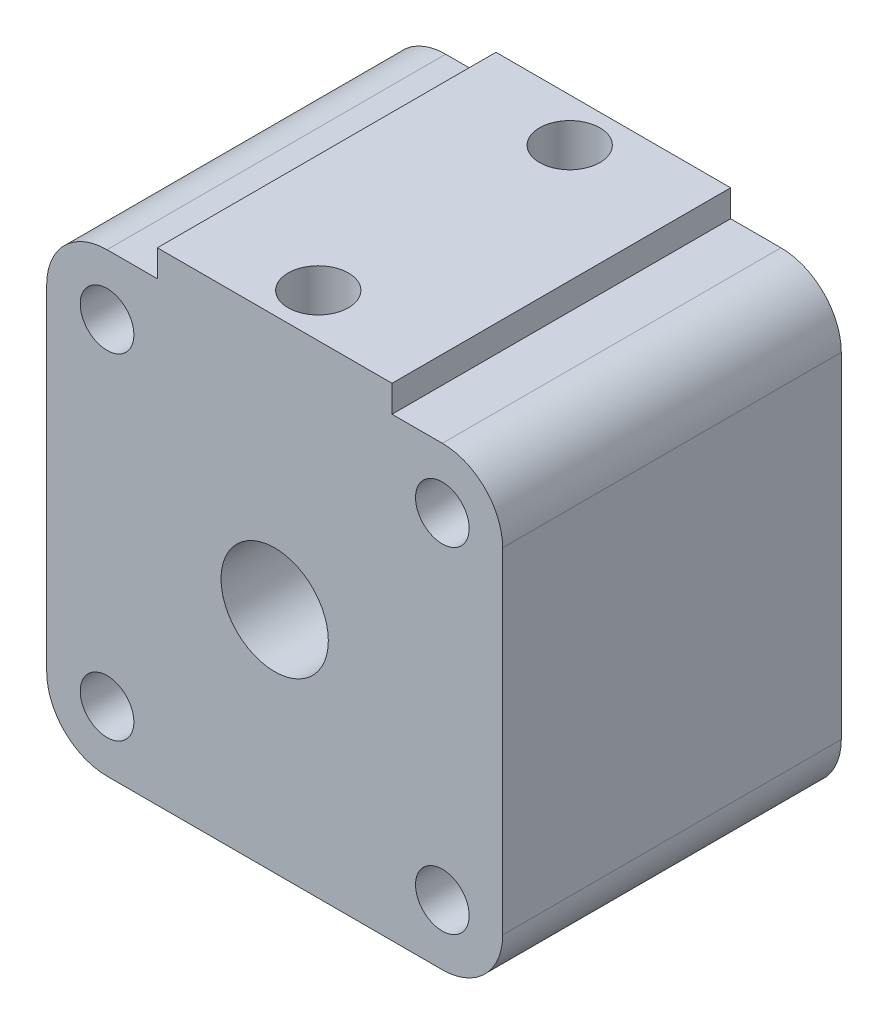
ISO-10303-21;
HEADER;
FILE_DESCRIPTION(('STEP AP214'),'2;1');
FILE_NAME('part.step','',(''),(''),'','','');
FILE_SCHEMA(('AUTOMOTIVE_DESIGN { 1 0 10303 214 1 1 1 1 }'));
ENDSEC;
DATA;
#1=APPLICATION_CONTEXT('core data for automotive mechanical design processes');
#2=APPLICATION_PROTOCOL_DEFINITION('international standard','automotive_design',2000,#1);
#3=PRODUCT_CONTEXT('',#1,'mechanical');
#4=PRODUCT('Part','Part','',(#3));
#5=PRODUCT_RELATED_PRODUCT_CATEGORY('part','',(#4));
#6=PRODUCT_DEFINITION_FORMATION('','',#4);
#7=PRODUCT_DEFINITION_CONTEXT('part definition',#1,'design');
#8=PRODUCT_DEFINITION('design','',#6,#7);
#9=PRODUCT_DEFINITION_SHAPE('','',#8);
#10=(LENGTH_UNIT() NAMED_UNIT(*) SI_UNIT(.MILLI.,.METRE.));
#11=(NAMED_UNIT(*) PLANE_ANGLE_UNIT() SI_UNIT($,.RADIAN.));
#12=(NAMED_UNIT(*) SI_UNIT($,.STERADIAN.) SOLID_ANGLE_UNIT());
#13=UNCERTAINTY_MEASURE_WITH_UNIT(LENGTH_MEASURE(1.E-05),#10,'distance_accuracy_value','');
#14=(GEOMETRIC_REPRESENTATION_CONTEXT(3) GLOBAL_UNCERTAINTY_ASSIGNED_CONTEXT((#13)) GLOBAL_UNIT_ASSIGNED_CONTEXT((#10,
#11,#12)) REPRESENTATION_CONTEXT('',''));
#15=CARTESIAN_POINT('',(0.,0.,0.));
#16=DIRECTION('',(0.,0.,1.));
#17=DIRECTION('',(1.,0.,0.));
#18=AXIS2_PLACEMENT_3D('',#15,#16,#17);
#19=CARTESIAN_POINT('',(25.,25.,-50.5));
#20=DIRECTION('',(0.,0.,1.));
#21=DIRECTION('',(1.,0.,0.));
#22=AXIS2_PLACEMENT_3D('',#19,#20,#21);
#23=CYLINDRICAL_SURFACE('',#22,9.00000000000001);
#24=CARTESIAN_POINT('',(25.,25.,0.));
#25=DIRECTION('',(0.,0.,1.));
#26=DIRECTION('',(-1.,0.,0.));
#27=AXIS2_PLACEMENT_3D('',#24,#25,#26);
#28=CIRCLE('',#27,9.00000000000001);
#29=CARTESIAN_POINT('',(34.,25.,0.));
#30=VERTEX_POINT('',#29);
#31=CARTESIAN_POINT('',(25.,34.,0.));
#32=VERTEX_POINT('',#31);
#33=EDGE_CURVE('E154',#30,#32,#28,.T.);
#34=ORIENTED_EDGE('',*,*,#33,.F.);
#35=DIRECTION('',(0.,0.,1.));
#36=VECTOR('',#35,1.);
#37=CARTESIAN_POINT('',(34.,25.,-50.5));
#38=LINE('',#37,#36);
#39=CARTESIAN_POINT('',(34.,25.,-50.5));
#40=VERTEX_POINT('',#39);
#41=EDGE_CURVE('E11',#40,#30,#38,.T.);
#42=ORIENTED_EDGE('',*,*,#41,.F.);
#43=CARTESIAN_POINT('',(25.,25.,-50.5));
#44=DIRECTION('',(0.,0.,1.));
#45=DIRECTION('',(-1.,0.,0.));
#46=AXIS2_PLACEMENT_3D('',#43,#44,#45);
#47=CIRCLE('',#46,9.00000000000001);
#48=CARTESIAN_POINT('',(25.,34.,-50.5));
#49=VERTEX_POINT('',#48);
#50=EDGE_CURVE('E187',#40,#49,#47,.T.);
#51=ORIENTED_EDGE('',*,*,#50,.T.);
#52=DIRECTION('',(0.,0.,1.));
#53=VECTOR('',#52,1.);
#54=CARTESIAN_POINT('',(25.,34.,-50.5));
#55=LINE('',#54,#53);
#56=EDGE_CURVE('E36',#49,#32,#55,.T.);
#57=ORIENTED_EDGE('',*,*,#56,.T.);
#58=EDGE_LOOP('',(#34,#42,#51,#57));
#59=FACE_BOUND('',#58,.T.);
#60=ADVANCED_FACE('F33',(#59),#23,.T.);
#61=CARTESIAN_POINT('',(34.,25.,-50.5));
#62=DIRECTION('',(1.,0.,0.));
#63=DIRECTION('',(0.,1.,0.));
#64=AXIS2_PLACEMENT_3D('',#61,#62,#63);
#65=PLANE('',#64);
#66=DIRECTION('',(0.,1.,0.));
#67=VECTOR('',#66,1.);
#68=CARTESIAN_POINT('',(34.,25.,0.));
#69=LINE('',#68,#67);
#70=CARTESIAN_POINT('',(34.,-25.,0.));
#71=VERTEX_POINT('',#70);
#72=EDGE_CURVE('E185',#71,#30,#69,.T.);
#73=ORIENTED_EDGE('',*,*,#72,.F.);
#74=DIRECTION('',(0.,0.,1.));
#75=VECTOR('',#74,1.);
#76=CARTESIAN_POINT('',(34.,-25.,-50.5));
#77=LINE('',#76,#75);
#78=CARTESIAN_POINT('',(34.,-25.,-50.5));
#79=VERTEX_POINT('',#78);
#80=EDGE_CURVE('E42',#79,#71,#77,.T.);
#81=ORIENTED_EDGE('',*,*,#80,.F.);
#82=DIRECTION('',(0.,1.,0.));
#83=VECTOR('',#82,1.);
#84=CARTESIAN_POINT('',(34.,25.,-50.5));
#85=LINE('',#84,#83);
#86=EDGE_CURVE('E144',#79,#40,#85,.T.);
#87=ORIENTED_EDGE('',*,*,#86,.T.);
#88=ORIENTED_EDGE('',*,*,#41,.T.);
#89=EDGE_LOOP('',(#73,#81,#87,#88));
#90=FACE_BOUND('',#89,.T.);
#91=ADVANCED_FACE('F207',(#90),#65,.T.);
#92=CARTESIAN_POINT('',(25.,-25.,-50.5));
#93=DIRECTION('',(0.,0.,1.));
#94=DIRECTION('',(1.,0.,0.));
#95=AXIS2_PLACEMENT_3D('',#92,#93,#94);
#96=CYLINDRICAL_SURFACE('',#95,9.00000000000001);
#97=CARTESIAN_POINT('',(25.,-25.,0.));
#98=DIRECTION('',(0.,0.,1.));
#99=DIRECTION('',(-1.,0.,0.));
#100=AXIS2_PLACEMENT_3D('',#97,#98,#99);
#101=CIRCLE('',#100,9.00000000000001);
#102=CARTESIAN_POINT('',(25.,-34.,0.));
#103=VERTEX_POINT('',#102);
#104=EDGE_CURVE('E131',#103,#71,#101,.T.);
#105=ORIENTED_EDGE('',*,*,#104,.F.);
#106=DIRECTION('',(0.,0.,1.));
#107=VECTOR('',#106,1.);
#108=CARTESIAN_POINT('',(25.,-34.,-50.5));
#109=LINE('',#108,#107);
#110=CARTESIAN_POINT('',(25.,-34.,-50.5));
#111=VERTEX_POINT('',#110);
#112=EDGE_CURVE('E126',#111,#103,#109,.T.);
#113=ORIENTED_EDGE('',*,*,#112,.F.);
#114=CARTESIAN_POINT('',(25.,-25.,-50.5));
#115=DIRECTION('',(0.,0.,1.));
#116=DIRECTION('',(-1.,0.,0.));
#117=AXIS2_PLACEMENT_3D('',#114,#115,#116);
#118=CIRCLE('',#117,9.00000000000001);
#119=EDGE_CURVE('E129',#111,#79,#118,.T.);
#120=ORIENTED_EDGE('',*,*,#119,.T.);
#121=ORIENTED_EDGE('',*,*,#80,.T.);
#122=EDGE_LOOP('',(#105,#113,#120,#121));
#123=FACE_BOUND('',#122,.T.);
#124=ADVANCED_FACE('F128',(#123),#96,.T.);
#125=CARTESIAN_POINT('',(-25.,-34.,-50.5));
#126=DIRECTION('',(0.,-1.,0.));
#127=DIRECTION('',(0.,0.,-1.));
#128=AXIS2_PLACEMENT_3D('',#125,#126,#127);
#129=PLANE('',#128);
#130=DIRECTION('',(1.,0.,0.));
#131=VECTOR('',#130,1.);
#132=CARTESIAN_POINT('',(-25.,-34.,0.));
#133=LINE('',#132,#131);
#134=CARTESIAN_POINT('',(-25.,-34.,0.));
#135=VERTEX_POINT('',#134);
#136=EDGE_CURVE('E182',#135,#103,#133,.T.);
#137=ORIENTED_EDGE('',*,*,#136,.F.);
#138=DIRECTION('',(0.,0.,1.));
#139=VECTOR('',#138,1.);
#140=CARTESIAN_POINT('',(-25.,-34.,-50.5));
#141=LINE('',#140,#139);
#142=CARTESIAN_POINT('',(-25.,-34.,-50.5));
#143=VERTEX_POINT('',#142);
#144=EDGE_CURVE('E136',#143,#135,#141,.T.);
#145=ORIENTED_EDGE('',*,*,#144,.F.);
#146=DIRECTION('',(1.,0.,0.));
#147=VECTOR('',#146,1.);
#148=CARTESIAN_POINT('',(-25.,-34.,-50.5));
#149=LINE('',#148,#147);
#150=EDGE_CURVE('E142',#143,#111,#149,.T.);
#151=ORIENTED_EDGE('',*,*,#150,.T.);
#152=ORIENTED_EDGE('',*,*,#112,.T.);
#153=EDGE_LOOP('',(#137,#145,#151,#152));
#154=FACE_BOUND('',#153,.T.);
#155=ADVANCED_FACE('F146',(#154),#129,.T.);
#156=CARTESIAN_POINT('',(-25.,-25.,-50.5));
#157=DIRECTION('',(0.,0.,1.));
#158=DIRECTION('',(1.,0.,0.));
#159=AXIS2_PLACEMENT_3D('',#156,#157,#158);
#160=CYLINDRICAL_SURFACE('',#159,9.00000000000001);
#161=CARTESIAN_POINT('',(-25.,-25.,0.));
#162=DIRECTION('',(0.,0.,1.));
#163=DIRECTION('',(-1.,0.,0.));
#164=AXIS2_PLACEMENT_3D('',#161,#162,#163);
#165=CIRCLE('',#164,9.00000000000001);
#166=CARTESIAN_POINT('',(-34.,-25.,0.));
#167=VERTEX_POINT('',#166);
#168=EDGE_CURVE('E179',#167,#135,#165,.T.);
#169=ORIENTED_EDGE('',*,*,#168,.F.);
#170=DIRECTION('',(0.,0.,1.));
#171=VECTOR('',#170,1.);
#172=CARTESIAN_POINT('',(-34.,-25.,-50.5));
#173=LINE('',#172,#171);
#174=CARTESIAN_POINT('',(-34.,-25.,-50.5));
#175=VERTEX_POINT('',#174);
#176=EDGE_CURVE('E191',#175,#167,#173,.T.);
#177=ORIENTED_EDGE('',*,*,#176,.F.);
#178=CARTESIAN_POINT('',(-25.,-25.,-50.5));
#179=DIRECTION('',(0.,0.,1.));
#180=DIRECTION('',(-1.,0.,0.));
#181=AXIS2_PLACEMENT_3D('',#178,#179,#180);
#182=CIRCLE('',#181,9.00000000000001);
#183=EDGE_CURVE('E147',#175,#143,#182,.T.);
#184=ORIENTED_EDGE('',*,*,#183,.T.);
#185=ORIENTED_EDGE('',*,*,#144,.T.);
#186=EDGE_LOOP('',(#169,#177,#184,#185));
#187=FACE_BOUND('',#186,.T.);
#188=ADVANCED_FACE('F220',(#187),#160,.T.);
#189=CARTESIAN_POINT('',(-34.,25.,-50.5));
#190=DIRECTION('',(-1.,0.,0.));
#191=DIRECTION('',(0.,0.,1.));
#192=AXIS2_PLACEMENT_3D('',#189,#190,#191);
#193=PLANE('',#192);
#194=DIRECTION('',(0.,-1.,0.));
#195=VECTOR('',#194,1.);
#196=CARTESIAN_POINT('',(-34.,25.,0.));
#197=LINE('',#196,#195);
#198=CARTESIAN_POINT('',(-34.,25.,0.));
#199=VERTEX_POINT('',#198);
#200=EDGE_CURVE('E176',#199,#167,#197,.T.);
#201=ORIENTED_EDGE('',*,*,#200,.F.);
#202=DIRECTION('',(0.,0.,1.));
#203=VECTOR('',#202,1.);
#204=CARTESIAN_POINT('',(-34.,25.,-50.5));
#205=LINE('',#204,#203);
#206=CARTESIAN_POINT('',(-34.,25.,-50.5));
#207=VERTEX_POINT('',#206);
#208=EDGE_CURVE('E193',#207,#199,#205,.T.);
#209=ORIENTED_EDGE('',*,*,#208,.F.);
#210=DIRECTION('',(0.,-1.,0.));
#211=VECTOR('',#210,1.);
#212=CARTESIAN_POINT('',(-34.,25.,-50.5));
#213=LINE('',#212,#211);
#214=EDGE_CURVE('E149',#207,#175,#213,.T.);
#215=ORIENTED_EDGE('',*,*,#214,.T.);
#216=ORIENTED_EDGE('',*,*,#176,.T.);
#217=EDGE_LOOP('',(#201,#209,#215,#216));
#218=FACE_BOUND('',#217,.T.);
#219=ADVANCED_FACE('F223',(#218),#193,.T.);
#220=CARTESIAN_POINT('',(-25.,25.,-50.5));
#221=DIRECTION('',(0.,0.,1.));
#222=DIRECTION('',(1.,0.,0.));
#223=AXIS2_PLACEMENT_3D('',#220,#221,#222);
#224=CYLINDRICAL_SURFACE('',#223,9.);
#225=CARTESIAN_POINT('',(-25.,25.,0.));
#226=DIRECTION('',(0.,0.,1.));
#227=DIRECTION('',(-1.,0.,0.));
#228=AXIS2_PLACEMENT_3D('',#225,#226,#227);
#229=CIRCLE('',#228,9.);
#230=CARTESIAN_POINT('',(-25.,34.,0.));
#231=VERTEX_POINT('',#230);
#232=EDGE_CURVE('E173',#231,#199,#229,.T.);
#233=ORIENTED_EDGE('',*,*,#232,.F.);
#234=DIRECTION('',(0.,0.,1.));
#235=VECTOR('',#234,1.);
#236=CARTESIAN_POINT('',(-25.,34.,-50.5));
#237=LINE('',#236,#235);
#238=CARTESIAN_POINT('',(-25.,34.,-50.5));
#239=VERTEX_POINT('',#238);
#240=EDGE_CURVE('E195',#239,#231,#237,.T.);
#241=ORIENTED_EDGE('',*,*,#240,.F.);
#242=CARTESIAN_POINT('',(-25.,25.,-50.5));
#243=DIRECTION('',(0.,0.,1.));
#244=DIRECTION('',(-1.,0.,0.));
#245=AXIS2_PLACEMENT_3D('',#242,#243,#244);
#246=CIRCLE('',#245,9.);
#247=EDGE_CURVE('E371',#239,#207,#246,.T.);
#248=ORIENTED_EDGE('',*,*,#247,.T.);
#249=ORIENTED_EDGE('',*,*,#208,.T.);
#250=EDGE_LOOP('',(#233,#241,#248,#249));
#251=FACE_BOUND('',#250,.T.);
#252=ADVANCED_FACE('F227',(#251),#224,.T.);
#253=CARTESIAN_POINT('',(-25.,34.,-50.5));
#254=DIRECTION('',(0.,1.,0.));
#255=DIRECTION('',(-1.,0.,0.));
#256=AXIS2_PLACEMENT_3D('',#253,#254,#255);
#257=PLANE('',#256);
#258=DIRECTION('',(-1.,0.,0.));
#259=VECTOR('',#258,1.);
#260=CARTESIAN_POINT('',(-25.,34.,0.));
#261=LINE('',#260,#259);
#262=CARTESIAN_POINT('',(-17.5,34.,0.));
#263=VERTEX_POINT('',#262);
#264=EDGE_CURVE('E170',#263,#231,#261,.T.);
#265=ORIENTED_EDGE('',*,*,#264,.F.);
#266=DIRECTION('',(0.,0.,1.));
#267=VECTOR('',#266,1.);
#268=CARTESIAN_POINT('',(-17.5,34.,-50.5));
#269=LINE('',#268,#267);
#270=CARTESIAN_POINT('',(-17.5,34.,-50.5));
#271=VERTEX_POINT('',#270);
#272=EDGE_CURVE('E197',#271,#263,#269,.T.);
#273=ORIENTED_EDGE('',*,*,#272,.F.);
#274=DIRECTION('',(-1.,0.,0.));
#275=VECTOR('',#274,1.);
#276=CARTESIAN_POINT('',(-25.,34.,-50.5));
#277=LINE('',#276,#275);
#278=EDGE_CURVE('E368',#271,#239,#277,.T.);
#279=ORIENTED_EDGE('',*,*,#278,.T.);
#280=ORIENTED_EDGE('',*,*,#240,.T.);
#281=EDGE_LOOP('',(#265,#273,#279,#280));
#282=FACE_BOUND('',#281,.T.);
#283=ADVANCED_FACE('F231',(#282),#257,.T.);
#284=CARTESIAN_POINT('',(-17.5,34.,-50.5));
#285=DIRECTION('',(-1.,0.,0.));
#286=DIRECTION('',(0.,0.,1.));
#287=AXIS2_PLACEMENT_3D('',#284,#285,#286);
#288=PLANE('',#287);
#289=DIRECTION('',(0.,-1.,0.));
#290=VECTOR('',#289,1.);
#291=CARTESIAN_POINT('',(-17.5,34.,0.));
#292=LINE('',#291,#290);
#293=CARTESIAN_POINT('',(-17.5,38.,0.));
#294=VERTEX_POINT('',#293);
#295=EDGE_CURVE('E167',#294,#263,#292,.T.);
#296=ORIENTED_EDGE('',*,*,#295,.F.);
#297=DIRECTION('',(0.,0.,1.));
#298=VECTOR('',#297,1.);
#299=CARTESIAN_POINT('',(-17.5,38.,-50.5));
#300=LINE('',#299,#298);
#301=CARTESIAN_POINT('',(-17.5,38.,-50.5));
#302=VERTEX_POINT('',#301);
#303=EDGE_CURVE('E199',#302,#294,#300,.T.);
#304=ORIENTED_EDGE('',*,*,#303,.F.);
#305=DIRECTION('',(0.,-1.,0.));
#306=VECTOR('',#305,1.);
#307=CARTESIAN_POINT('',(-17.5,34.,-50.5));
#308=LINE('',#307,#306);
#309=EDGE_CURVE('E365',#302,#271,#308,.T.);
#310=ORIENTED_EDGE('',*,*,#309,.T.);
#311=ORIENTED_EDGE('',*,*,#272,.T.);
#312=EDGE_LOOP('',(#296,#304,#310,#311));
#313=FACE_BOUND('',#312,.T.);
#314=ADVANCED_FACE('F235',(#313),#288,.T.);
#315=CARTESIAN_POINT('',(-17.5,38.,-50.5));
#316=DIRECTION('',(0.,1.,0.));
#317=DIRECTION('',(0.,0.,1.));
#318=AXIS2_PLACEMENT_3D('',#315,#316,#317);
#319=PLANE('',#318);
#320=CARTESIAN_POINT('',(0.,38.,-44.));
#321=DIRECTION('',(0.,1.,0.));
#322=DIRECTION('',(0.,0.,1.));
#323=AXIS2_PLACEMENT_3D('',#320,#321,#322);
#324=CIRCLE('',#323,4.5);
#325=CARTESIAN_POINT('',(0.,38.,-39.5));
#326=VERTEX_POINT('',#325);
#327=EDGE_CURVE('E317',#326,#326,#324,.T.);
#328=ORIENTED_EDGE('',*,*,#327,.F.);
#329=EDGE_LOOP('',(#328));
#330=FACE_BOUND('',#329,.T.);
#331=CARTESIAN_POINT('',(0.,38.,-6.5));
#332=DIRECTION('',(0.,1.,0.));
#333=DIRECTION('',(0.,0.,1.));
#334=AXIS2_PLACEMENT_3D('',#331,#332,#333);
#335=CIRCLE('',#334,4.5);
#336=CARTESIAN_POINT('',(0.,38.,-2.));
#337=VERTEX_POINT('',#336);
#338=EDGE_CURVE('E316',#337,#337,#335,.T.);
#339=ORIENTED_EDGE('',*,*,#338,.F.);
#340=EDGE_LOOP('',(#339));
#341=FACE_BOUND('',#340,.T.);
#342=DIRECTION('',(-1.,0.,0.));
#343=VECTOR('',#342,1.);
#344=CARTESIAN_POINT('',(-17.5,38.,0.));
#345=LINE('',#344,#343);
#346=CARTESIAN_POINT('',(17.5,38.,0.));
#347=VERTEX_POINT('',#346);
#348=EDGE_CURVE('E164',#347,#294,#345,.T.);
#349=ORIENTED_EDGE('',*,*,#348,.F.);
#350=DIRECTION('',(0.,0.,1.));
#351=VECTOR('',#350,1.);
#352=CARTESIAN_POINT('',(17.5,38.,-50.5));
#353=LINE('',#352,#351);
#354=CARTESIAN_POINT('',(17.5,38.,-50.5));
#355=VERTEX_POINT('',#354);
#356=EDGE_CURVE('E201',#355,#347,#353,.T.);
#357=ORIENTED_EDGE('',*,*,#356,.F.);
#358=DIRECTION('',(-1.,0.,0.));
#359=VECTOR('',#358,1.);
#360=CARTESIAN_POINT('',(-17.5,38.,-50.5));
#361=LINE('',#360,#359);
#362=EDGE_CURVE('E362',#355,#302,#361,.T.);
#363=ORIENTED_EDGE('',*,*,#362,.T.);
#364=ORIENTED_EDGE('',*,*,#303,.T.);
#365=EDGE_LOOP('',(#349,#357,#363,#364));
#366=FACE_BOUND('',#365,.T.);
#367=ADVANCED_FACE('F239',(#330,#341,#366),#319,.T.);
#368=CARTESIAN_POINT('',(17.5,38.,-50.5));
#369=DIRECTION('',(1.,0.,0.));
#370=DIRECTION('',(0.,0.,-1.));
#371=AXIS2_PLACEMENT_3D('',#368,#369,#370);
#372=PLANE('',#371);
#373=DIRECTION('',(0.,1.,0.));
#374=VECTOR('',#373,1.);
#375=CARTESIAN_POINT('',(17.5,38.,0.));
#376=LINE('',#375,#374);
#377=CARTESIAN_POINT('',(17.5,34.,0.));
#378=VERTEX_POINT('',#377);
#379=EDGE_CURVE('E161',#378,#347,#376,.T.);
#380=ORIENTED_EDGE('',*,*,#379,.F.);
#381=DIRECTION('',(0.,0.,1.));
#382=VECTOR('',#381,1.);
#383=CARTESIAN_POINT('',(17.5,34.,-50.5));
#384=LINE('',#383,#382);
#385=CARTESIAN_POINT('',(17.5,34.,-50.5));
#386=VERTEX_POINT('',#385);
#387=EDGE_CURVE('E202',#386,#378,#384,.T.);
#388=ORIENTED_EDGE('',*,*,#387,.F.);
#389=DIRECTION('',(0.,1.,0.));
#390=VECTOR('',#389,1.);
#391=CARTESIAN_POINT('',(17.5,38.,-50.5));
#392=LINE('',#391,#390);
#393=EDGE_CURVE('E359',#386,#355,#392,.T.);
#394=ORIENTED_EDGE('',*,*,#393,.T.);
#395=ORIENTED_EDGE('',*,*,#356,.T.);
#396=EDGE_LOOP('',(#380,#388,#394,#395));
#397=FACE_BOUND('',#396,.T.);
#398=ADVANCED_FACE('F243',(#397),#372,.T.);
#399=CARTESIAN_POINT('',(17.5,34.,-50.5));
#400=DIRECTION('',(0.,1.,0.));
#401=DIRECTION('',(-1.,0.,0.));
#402=AXIS2_PLACEMENT_3D('',#399,#400,#401);
#403=PLANE('',#402);
#404=DIRECTION('',(-1.,0.,0.));
#405=VECTOR('',#404,1.);
#406=CARTESIAN_POINT('',(17.5,34.,0.));
#407=LINE('',#406,#405);
#408=EDGE_CURVE('E157',#32,#378,#407,.T.);
#409=ORIENTED_EDGE('',*,*,#408,.F.);
#410=ORIENTED_EDGE('',*,*,#56,.F.);
#411=DIRECTION('',(-1.,0.,0.));
#412=VECTOR('',#411,1.);
#413=CARTESIAN_POINT('',(17.5,34.,-50.5));
#414=LINE('',#413,#412);
#415=EDGE_CURVE('E357',#49,#386,#414,.T.);
#416=ORIENTED_EDGE('',*,*,#415,.T.);
#417=ORIENTED_EDGE('',*,*,#387,.T.);
#418=EDGE_LOOP('',(#409,#410,#416,#417));
#419=FACE_BOUND('',#418,.T.);
#420=ADVANCED_FACE('F204',(#419),#403,.T.);
#421=CARTESIAN_POINT('',(25.,25.,-50.5));
#422=DIRECTION('',(0.,0.,-1.));
#423=DIRECTION('',(-1.,0.,0.));
#424=AXIS2_PLACEMENT_3D('',#421,#422,#423);
#425=PLANE('',#424);
#426=ORIENTED_EDGE('',*,*,#50,.F.);
#427=ORIENTED_EDGE('',*,*,#86,.F.);
#428=ORIENTED_EDGE('',*,*,#119,.F.);
#429=ORIENTED_EDGE('',*,*,#150,.F.);
#430=ORIENTED_EDGE('',*,*,#183,.F.);
#431=ORIENTED_EDGE('',*,*,#214,.F.);
#432=ORIENTED_EDGE('',*,*,#247,.F.);
#433=ORIENTED_EDGE('',*,*,#278,.F.);
#434=ORIENTED_EDGE('',*,*,#309,.F.);
#435=ORIENTED_EDGE('',*,*,#362,.F.);
#436=ORIENTED_EDGE('',*,*,#393,.F.);
#437=ORIENTED_EDGE('',*,*,#415,.F.);
#438=EDGE_LOOP('',(#426,#427,#428,#429,#430,#431,#432,#433,#434,#435,#436,#437));
#439=FACE_BOUND('',#438,.T.);
#440=ADVANCED_FACE('F140',(#439),#425,.T.);
#441=CARTESIAN_POINT('',(25.,25.,0.));
#442=DIRECTION('',(0.,0.,-1.));
#443=DIRECTION('',(-1.,0.,0.));
#444=AXIS2_PLACEMENT_3D('',#441,#442,#443);
#445=PLANE('',#444);
#446=CARTESIAN_POINT('',(0.,0.,0.));
#447=DIRECTION('',(0.,0.,1.));
#448=DIRECTION('',(1.,0.,0.));
#449=AXIS2_PLACEMENT_3D('',#446,#447,#448);
#450=CIRCLE('',#449,8.);
#451=CARTESIAN_POINT('',(8.,0.,0.));
#452=VERTEX_POINT('',#451);
#453=EDGE_CURVE('E326',#452,#452,#450,.T.);
#454=ORIENTED_EDGE('',*,*,#453,.F.);
#455=EDGE_LOOP('',(#454));
#456=FACE_BOUND('',#455,.T.);
#457=CARTESIAN_POINT('',(25.,25.,0.));
#458=DIRECTION('',(0.,0.,1.));
#459=DIRECTION('',(1.,0.,0.));
#460=AXIS2_PLACEMENT_3D('',#457,#458,#459);
#461=CIRCLE('',#460,4.);
#462=CARTESIAN_POINT('',(29.,25.,0.));
#463=VERTEX_POINT('',#462);
#464=EDGE_CURVE('E331',#463,#463,#461,.T.);
#465=ORIENTED_EDGE('',*,*,#464,.F.);
#466=EDGE_LOOP('',(#465));
#467=FACE_BOUND('',#466,.T.);
#468=CARTESIAN_POINT('',(25.,-25.,0.));
#469=DIRECTION('',(0.,0.,1.));
#470=DIRECTION('',(1.,0.,0.));
#471=AXIS2_PLACEMENT_3D('',#468,#469,#470);
#472=CIRCLE('',#471,4.);
#473=CARTESIAN_POINT('',(29.,-25.,0.));
#474=VERTEX_POINT('',#473);
#475=EDGE_CURVE('E337',#474,#474,#472,.T.);
#476=ORIENTED_EDGE('',*,*,#475,.F.);
#477=EDGE_LOOP('',(#476));
#478=FACE_BOUND('',#477,.T.);
#479=CARTESIAN_POINT('',(-25.,-25.,0.));
#480=DIRECTION('',(0.,0.,1.));
#481=DIRECTION('',(1.,0.,0.));
#482=AXIS2_PLACEMENT_3D('',#479,#480,#481);
#483=CIRCLE('',#482,4.);
#484=CARTESIAN_POINT('',(-21.,-25.,0.));
#485=VERTEX_POINT('',#484);
#486=EDGE_CURVE('E343',#485,#485,#483,.T.);
#487=ORIENTED_EDGE('',*,*,#486,.F.);
#488=EDGE_LOOP('',(#487));
#489=FACE_BOUND('',#488,.T.);
#490=CARTESIAN_POINT('',(-25.,25.,0.));
#491=DIRECTION('',(0.,0.,1.));
#492=DIRECTION('',(1.,0.,0.));
#493=AXIS2_PLACEMENT_3D('',#490,#491,#492);
#494=CIRCLE('',#493,4.);
#495=CARTESIAN_POINT('',(-21.,25.,0.));
#496=VERTEX_POINT('',#495);
#497=EDGE_CURVE('E349',#496,#496,#494,.T.);
#498=ORIENTED_EDGE('',*,*,#497,.F.);
#499=EDGE_LOOP('',(#498));
#500=FACE_BOUND('',#499,.T.);
#501=ORIENTED_EDGE('',*,*,#33,.T.);
#502=ORIENTED_EDGE('',*,*,#408,.T.);
#503=ORIENTED_EDGE('',*,*,#379,.T.);
#504=ORIENTED_EDGE('',*,*,#348,.T.);
#505=ORIENTED_EDGE('',*,*,#295,.T.);
#506=ORIENTED_EDGE('',*,*,#264,.T.);
#507=ORIENTED_EDGE('',*,*,#232,.T.);
#508=ORIENTED_EDGE('',*,*,#200,.T.);
#509=ORIENTED_EDGE('',*,*,#168,.T.);
#510=ORIENTED_EDGE('',*,*,#136,.T.);
#511=ORIENTED_EDGE('',*,*,#104,.T.);
#512=ORIENTED_EDGE('',*,*,#72,.T.);
#513=EDGE_LOOP('',(#501,#502,#503,#504,#505,#506,#507,#508,#509,#510,#511,#512));
#514=FACE_BOUND('',#513,.T.);
#515=ADVANCED_FACE('F206',(#456,#467,#478,#489,#500,#514),#445,.F.);
#516=CARTESIAN_POINT('',(-25.,25.,-20.));
#517=DIRECTION('',(0.,0.,1.));
#518=DIRECTION('',(1.,0.,0.));
#519=AXIS2_PLACEMENT_3D('',#516,#517,#518);
#520=CYLINDRICAL_SURFACE('',#519,4.);
#521=CARTESIAN_POINT('',(-25.,25.,-20.));
#522=DIRECTION('',(0.,0.,1.));
#523=DIRECTION('',(1.,0.,0.));
#524=AXIS2_PLACEMENT_3D('',#521,#522,#523);
#525=CIRCLE('',#524,4.);
#526=CARTESIAN_POINT('',(-21.,25.,-20.));
#527=VERTEX_POINT('',#526);
#528=EDGE_CURVE('E158',#527,#527,#525,.T.);
#529=ORIENTED_EDGE('',*,*,#528,.F.);
#530=EDGE_LOOP('',(#529));
#531=FACE_BOUND('',#530,.T.);
#532=ORIENTED_EDGE('',*,*,#497,.T.);
#533=EDGE_LOOP('',(#532));
#534=FACE_BOUND('',#533,.T.);
#535=ADVANCED_FACE('F254',(#531,#534),#520,.F.);
#536=CARTESIAN_POINT('',(-25.,25.,-20.));
#537=DIRECTION('',(0.,0.,1.));
#538=DIRECTION('',(1.,0.,0.));
#539=AXIS2_PLACEMENT_3D('',#536,#537,#538);
#540=PLANE('',#539);
#541=ORIENTED_EDGE('',*,*,#528,.T.);
#542=EDGE_LOOP('',(#541));
#543=FACE_BOUND('',#542,.T.);
#544=ADVANCED_FACE('F259',(#543),#540,.T.);
#545=CARTESIAN_POINT('',(-25.,-25.,-20.));
#546=DIRECTION('',(0.,0.,1.));
#547=DIRECTION('',(1.,0.,0.));
#548=AXIS2_PLACEMENT_3D('',#545,#546,#547);
#549=CYLINDRICAL_SURFACE('',#548,4.);
#550=CARTESIAN_POINT('',(-25.,-25.,-20.));
#551=DIRECTION('',(0.,0.,1.));
#552=DIRECTION('',(1.,0.,0.));
#553=AXIS2_PLACEMENT_3D('',#550,#551,#552);
#554=CIRCLE('',#553,4.);
#555=CARTESIAN_POINT('',(-21.,-25.,-20.));
#556=VERTEX_POINT('',#555);
#557=EDGE_CURVE('E346',#556,#556,#554,.T.);
#558=ORIENTED_EDGE('',*,*,#557,.F.);
#559=EDGE_LOOP('',(#558));
#560=FACE_BOUND('',#559,.T.);
#561=ORIENTED_EDGE('',*,*,#486,.T.);
#562=EDGE_LOOP('',(#561));
#563=FACE_BOUND('',#562,.T.);
#564=ADVANCED_FACE('F263',(#560,#563),#549,.F.);
#565=CARTESIAN_POINT('',(-25.,-25.,-20.));
#566=DIRECTION('',(0.,0.,1.));
#567=DIRECTION('',(1.,0.,0.));
#568=AXIS2_PLACEMENT_3D('',#565,#566,#567);
#569=PLANE('',#568);
#570=ORIENTED_EDGE('',*,*,#557,.T.);
#571=EDGE_LOOP('',(#570));
#572=FACE_BOUND('',#571,.T.);
#573=ADVANCED_FACE('F267',(#572),#569,.T.);
#574=CARTESIAN_POINT('',(25.,-25.,-20.));
#575=DIRECTION('',(0.,0.,1.));
#576=DIRECTION('',(1.,0.,0.));
#577=AXIS2_PLACEMENT_3D('',#574,#575,#576);
#578=CYLINDRICAL_SURFACE('',#577,4.);
#579=CARTESIAN_POINT('',(25.,-25.,-20.));
#580=DIRECTION('',(0.,0.,1.));
#581=DIRECTION('',(1.,0.,0.));
#582=AXIS2_PLACEMENT_3D('',#579,#580,#581);
#583=CIRCLE('',#582,4.);
#584=CARTESIAN_POINT('',(29.,-25.,-20.));
#585=VERTEX_POINT('',#584);
#586=EDGE_CURVE('E340',#585,#585,#583,.T.);
#587=ORIENTED_EDGE('',*,*,#586,.F.);
#588=EDGE_LOOP('',(#587));
#589=FACE_BOUND('',#588,.T.);
#590=ORIENTED_EDGE('',*,*,#475,.T.);
#591=EDGE_LOOP('',(#590));
#592=FACE_BOUND('',#591,.T.);
#593=ADVANCED_FACE('F271',(#589,#592),#578,.F.);
#594=CARTESIAN_POINT('',(25.,-25.,-20.));
#595=DIRECTION('',(0.,0.,1.));
#596=DIRECTION('',(1.,0.,0.));
#597=AXIS2_PLACEMENT_3D('',#594,#595,#596);
#598=PLANE('',#597);
#599=ORIENTED_EDGE('',*,*,#586,.T.);
#600=EDGE_LOOP('',(#599));
#601=FACE_BOUND('',#600,.T.);
#602=ADVANCED_FACE('F275',(#601),#598,.T.);
#603=CARTESIAN_POINT('',(25.,25.,-20.));
#604=DIRECTION('',(0.,0.,1.));
#605=DIRECTION('',(1.,0.,0.));
#606=AXIS2_PLACEMENT_3D('',#603,#604,#605);
#607=CYLINDRICAL_SURFACE('',#606,4.);
#608=CARTESIAN_POINT('',(25.,25.,-20.));
#609=DIRECTION('',(0.,0.,1.));
#610=DIRECTION('',(1.,0.,0.));
#611=AXIS2_PLACEMENT_3D('',#608,#609,#610);
#612=CIRCLE('',#611,4.);
#613=CARTESIAN_POINT('',(29.,25.,-20.));
#614=VERTEX_POINT('',#613);
#615=EDGE_CURVE('E334',#614,#614,#612,.T.);
#616=ORIENTED_EDGE('',*,*,#615,.F.);
#617=EDGE_LOOP('',(#616));
#618=FACE_BOUND('',#617,.T.);
#619=ORIENTED_EDGE('',*,*,#464,.T.);
#620=EDGE_LOOP('',(#619));
#621=FACE_BOUND('',#620,.T.);
#622=ADVANCED_FACE('F279',(#618,#621),#607,.F.);
#623=CARTESIAN_POINT('',(25.,25.,-20.));
#624=DIRECTION('',(0.,0.,1.));
#625=DIRECTION('',(1.,0.,0.));
#626=AXIS2_PLACEMENT_3D('',#623,#624,#625);
#627=PLANE('',#626);
#628=ORIENTED_EDGE('',*,*,#615,.T.);
#629=EDGE_LOOP('',(#628));
#630=FACE_BOUND('',#629,.T.);
#631=ADVANCED_FACE('F283',(#630),#627,.T.);
#632=CARTESIAN_POINT('',(0.,0.,-20.));
#633=DIRECTION('',(0.,0.,1.));
#634=DIRECTION('',(1.,0.,0.));
#635=AXIS2_PLACEMENT_3D('',#632,#633,#634);
#636=CYLINDRICAL_SURFACE('',#635,8.);
#637=CARTESIAN_POINT('',(0.,0.,-20.));
#638=DIRECTION('',(0.,0.,1.));
#639=DIRECTION('',(1.,0.,0.));
#640=AXIS2_PLACEMENT_3D('',#637,#638,#639);
#641=CIRCLE('',#640,8.);
#642=CARTESIAN_POINT('',(8.,0.,-20.));
#643=VERTEX_POINT('',#642);
#644=EDGE_CURVE('E328',#643,#643,#641,.T.);
#645=ORIENTED_EDGE('',*,*,#644,.F.);
#646=EDGE_LOOP('',(#645));
#647=FACE_BOUND('',#646,.T.);
#648=ORIENTED_EDGE('',*,*,#453,.T.);
#649=EDGE_LOOP('',(#648));
#650=FACE_BOUND('',#649,.T.);
#651=ADVANCED_FACE('F287',(#647,#650),#636,.F.);
#652=CARTESIAN_POINT('',(0.,0.,-20.));
#653=DIRECTION('',(0.,0.,1.));
#654=DIRECTION('',(1.,0.,0.));
#655=AXIS2_PLACEMENT_3D('',#652,#653,#654);
#656=PLANE('',#655);
#657=ORIENTED_EDGE('',*,*,#644,.T.);
#658=EDGE_LOOP('',(#657));
#659=FACE_BOUND('',#658,.T.);
#660=ADVANCED_FACE('F291',(#659),#656,.T.);
#661=CARTESIAN_POINT('',(0.,28.,-6.5));
#662=DIRECTION('',(0.,1.,0.));
#663=DIRECTION('',(0.,0.,1.));
#664=AXIS2_PLACEMENT_3D('',#661,#662,#663);
#665=CYLINDRICAL_SURFACE('',#664,4.5);
#666=CARTESIAN_POINT('',(0.,28.,-6.5));
#667=DIRECTION('',(0.,1.,0.));
#668=DIRECTION('',(0.,0.,1.));
#669=AXIS2_PLACEMENT_3D('',#666,#667,#668);
#670=CIRCLE('',#669,4.5);
#671=CARTESIAN_POINT('',(0.,28.,-2.));
#672=VERTEX_POINT('',#671);
#673=EDGE_CURVE('E320',#672,#672,#670,.T.);
#674=ORIENTED_EDGE('',*,*,#673,.F.);
#675=EDGE_LOOP('',(#674));
#676=FACE_BOUND('',#675,.T.);
#677=ORIENTED_EDGE('',*,*,#338,.T.);
#678=EDGE_LOOP('',(#677));
#679=FACE_BOUND('',#678,.T.);
#680=ADVANCED_FACE('F295',(#676,#679),#665,.F.);
#681=CARTESIAN_POINT('',(0.,28.,-6.5));
#682=DIRECTION('',(0.,1.,0.));
#683=DIRECTION('',(0.,0.,1.));
#684=AXIS2_PLACEMENT_3D('',#681,#682,#683);
#685=PLANE('',#684);
#686=ORIENTED_EDGE('',*,*,#673,.T.);
#687=EDGE_LOOP('',(#686));
#688=FACE_BOUND('',#687,.T.);
#689=ADVANCED_FACE('F299',(#688),#685,.T.);
#690=CARTESIAN_POINT('',(0.,28.,-44.));
#691=DIRECTION('',(0.,1.,0.));
#692=DIRECTION('',(0.,0.,1.));
#693=AXIS2_PLACEMENT_3D('',#690,#691,#692);
#694=CYLINDRICAL_SURFACE('',#693,4.5);
#695=CARTESIAN_POINT('',(0.,28.,-44.));
#696=DIRECTION('',(0.,1.,0.));
#697=DIRECTION('',(0.,0.,1.));
#698=AXIS2_PLACEMENT_3D('',#695,#696,#697);
#699=CIRCLE('',#698,4.5);
#700=CARTESIAN_POINT('',(0.,28.,-39.5));
#701=VERTEX_POINT('',#700);
#702=EDGE_CURVE('E315',#701,#701,#699,.T.);
#703=ORIENTED_EDGE('',*,*,#702,.F.);
#704=EDGE_LOOP('',(#703));
#705=FACE_BOUND('',#704,.T.);
#706=ORIENTED_EDGE('',*,*,#327,.T.);
#707=EDGE_LOOP('',(#706));
#708=FACE_BOUND('',#707,.T.);
#709=ADVANCED_FACE('F303',(#705,#708),#694,.F.);
#710=CARTESIAN_POINT('',(0.,28.,-44.));
#711=DIRECTION('',(0.,1.,0.));
#712=DIRECTION('',(0.,0.,1.));
#713=AXIS2_PLACEMENT_3D('',#710,#711,#712);
#714=PLANE('',#713);
#715=ORIENTED_EDGE('',*,*,#702,.T.);
#716=EDGE_LOOP('',(#715));
#717=FACE_BOUND('',#716,.T.);
#718=ADVANCED_FACE('F307',(#717),#714,.T.);
#719=CLOSED_SHELL('',(#60,#91,#124,#155,#188,#219,#252,#283,#314,#367,#398,#420,#440,#515,#535,
#544,#564,#573,#593,#602,#622,#631,#651,#660,#680,#689,#709,#718));
#720=MANIFOLD_SOLID_BREP('B2',#719);
#721=ADVANCED_BREP_SHAPE_REPRESENTATION('',(#18,#720),#14);
#722=SHAPE_DEFINITION_REPRESENTATION(#9,#721);
ENDSEC;
END-ISO-10303-21;
